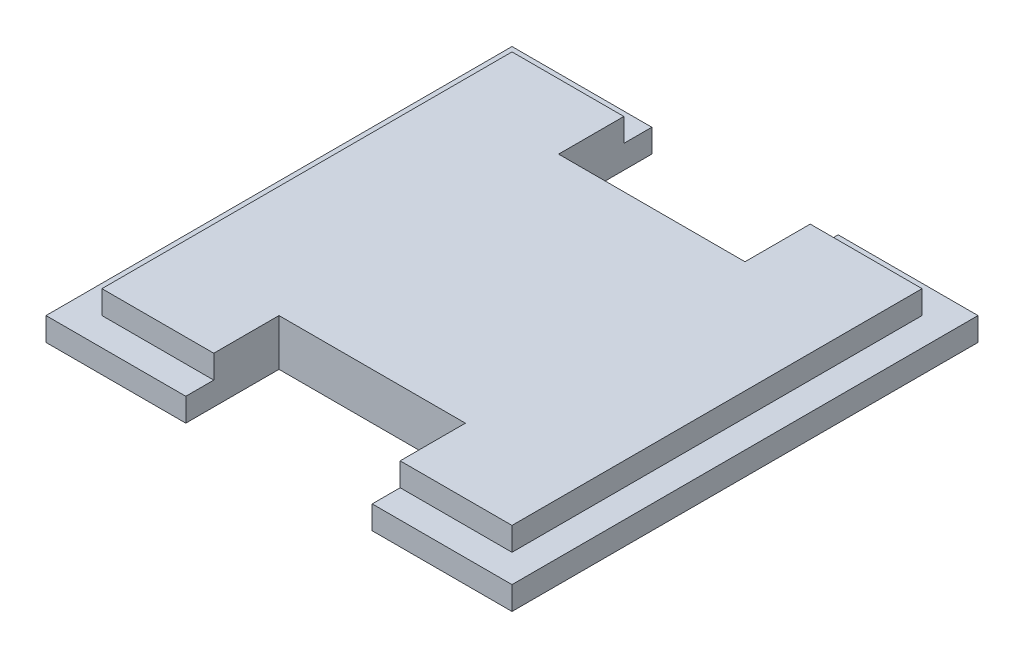
ISO-10303-21;
HEADER;
FILE_DESCRIPTION(('STEP AP214'),'2;1');
FILE_NAME('part.step','',(''),(''),'','','');
FILE_SCHEMA(('AUTOMOTIVE_DESIGN { 1 0 10303 214 1 1 1 1 }'));
ENDSEC;
DATA;
#1=APPLICATION_CONTEXT('core data for automotive mechanical design processes');
#2=APPLICATION_PROTOCOL_DEFINITION('international standard','automotive_design',2000,#1);
#3=PRODUCT_CONTEXT('',#1,'mechanical');
#4=PRODUCT('Part','Part','',(#3));
#5=PRODUCT_RELATED_PRODUCT_CATEGORY('part','',(#4));
#6=PRODUCT_DEFINITION_FORMATION('','',#4);
#7=PRODUCT_DEFINITION_CONTEXT('part definition',#1,'design');
#8=PRODUCT_DEFINITION('design','',#6,#7);
#9=PRODUCT_DEFINITION_SHAPE('','',#8);
#10=(LENGTH_UNIT() NAMED_UNIT(*) SI_UNIT(.MILLI.,.METRE.));
#11=(NAMED_UNIT(*) PLANE_ANGLE_UNIT() SI_UNIT($,.RADIAN.));
#12=(NAMED_UNIT(*) SI_UNIT($,.STERADIAN.) SOLID_ANGLE_UNIT());
#13=UNCERTAINTY_MEASURE_WITH_UNIT(LENGTH_MEASURE(1.E-05),#10,'distance_accuracy_value','');
#14=(GEOMETRIC_REPRESENTATION_CONTEXT(3) GLOBAL_UNCERTAINTY_ASSIGNED_CONTEXT((#13)) GLOBAL_UNIT_ASSIGNED_CONTEXT((#10,
#11,#12)) REPRESENTATION_CONTEXT('',''));
#15=CARTESIAN_POINT('',(0.,0.,0.));
#16=DIRECTION('',(0.,0.,1.));
#17=DIRECTION('',(1.,0.,0.));
#18=AXIS2_PLACEMENT_3D('',#15,#16,#17);
#19=CARTESIAN_POINT('',(0.,5.,0.));
#20=DIRECTION('',(0.,-1.,0.));
#21=DIRECTION('',(0.,0.,-1.));
#22=AXIS2_PLACEMENT_3D('',#19,#20,#21);
#23=PLANE('',#22);
#24=DIRECTION('',(-1.,0.,0.));
#25=VECTOR('',#24,1.);
#26=CARTESIAN_POINT('',(94.,5.,-94.));
#27=LINE('',#26,#25);
#28=CARTESIAN_POINT('',(30.,5.,-94.));
#29=VERTEX_POINT('',#28);
#30=CARTESIAN_POINT('',(6.,5.,-94.));
#31=VERTEX_POINT('',#30);
#32=EDGE_CURVE('E304',#29,#31,#27,.T.);
#33=ORIENTED_EDGE('',*,*,#32,.F.);
#34=DIRECTION('',(0.,0.,-1.));
#35=VECTOR('',#34,1.);
#36=CARTESIAN_POINT('',(30.,5.,0.));
#37=LINE('',#36,#35);
#38=CARTESIAN_POINT('',(30.,5.,-100.));
#39=VERTEX_POINT('',#38);
#40=EDGE_CURVE('E275',#29,#39,#37,.T.);
#41=ORIENTED_EDGE('',*,*,#40,.T.);
#42=DIRECTION('',(-1.,0.,0.));
#43=VECTOR('',#42,1.);
#44=CARTESIAN_POINT('',(0.,5.,-100.));
#45=LINE('',#44,#43);
#46=CARTESIAN_POINT('',(0.,5.,-100.));
#47=VERTEX_POINT('',#46);
#48=EDGE_CURVE('E342',#39,#47,#45,.T.);
#49=ORIENTED_EDGE('',*,*,#48,.T.);
#50=DIRECTION('',(0.,0.,1.));
#51=VECTOR('',#50,1.);
#52=CARTESIAN_POINT('',(0.,5.,0.));
#53=LINE('',#52,#51);
#54=CARTESIAN_POINT('',(0.,5.,0.));
#55=VERTEX_POINT('',#54);
#56=EDGE_CURVE('E329',#47,#55,#53,.T.);
#57=ORIENTED_EDGE('',*,*,#56,.T.);
#58=DIRECTION('',(1.,0.,0.));
#59=VECTOR('',#58,1.);
#60=CARTESIAN_POINT('',(0.,5.,0.));
#61=LINE('',#60,#59);
#62=CARTESIAN_POINT('',(30.,5.,0.));
#63=VERTEX_POINT('',#62);
#64=EDGE_CURVE('E335',#55,#63,#61,.T.);
#65=ORIENTED_EDGE('',*,*,#64,.T.);
#66=DIRECTION('',(0.,0.,-1.));
#67=VECTOR('',#66,1.);
#68=CARTESIAN_POINT('',(30.,5.,0.));
#69=LINE('',#68,#67);
#70=CARTESIAN_POINT('',(30.,5.,-6.));
#71=VERTEX_POINT('',#70);
#72=EDGE_CURVE('E261',#63,#71,#69,.T.);
#73=ORIENTED_EDGE('',*,*,#72,.T.);
#74=DIRECTION('',(1.,0.,0.));
#75=VECTOR('',#74,1.);
#76=CARTESIAN_POINT('',(6.,5.,-6.));
#77=LINE('',#76,#75);
#78=CARTESIAN_POINT('',(6.,5.,-6.));
#79=VERTEX_POINT('',#78);
#80=EDGE_CURVE('E296',#79,#71,#77,.T.);
#81=ORIENTED_EDGE('',*,*,#80,.F.);
#82=DIRECTION('',(0.,0.,1.));
#83=VECTOR('',#82,1.);
#84=CARTESIAN_POINT('',(6.,5.,-94.));
#85=LINE('',#84,#83);
#86=EDGE_CURVE('E309',#31,#79,#85,.T.);
#87=ORIENTED_EDGE('',*,*,#86,.F.);
#88=EDGE_LOOP('',(#33,#41,#49,#57,#65,#73,#81,#87));
#89=FACE_BOUND('',#88,.T.);
#90=ADVANCED_FACE('F41',(#89),#23,.F.);
#91=CARTESIAN_POINT('',(0.,5.,0.));
#92=DIRECTION('',(0.,0.,-1.));
#93=DIRECTION('',(-1.,0.,0.));
#94=AXIS2_PLACEMENT_3D('',#91,#92,#93);
#95=PLANE('',#94);
#96=DIRECTION('',(1.,0.,0.));
#97=VECTOR('',#96,1.);
#98=CARTESIAN_POINT('',(0.,0.,0.));
#99=LINE('',#98,#97);
#100=CARTESIAN_POINT('',(0.,0.,0.));
#101=VERTEX_POINT('',#100);
#102=CARTESIAN_POINT('',(30.,0.,0.));
#103=VERTEX_POINT('',#102);
#104=EDGE_CURVE('E352',#101,#103,#99,.T.);
#105=ORIENTED_EDGE('',*,*,#104,.T.);
#106=DIRECTION('',(0.,-1.,0.));
#107=VECTOR('',#106,1.);
#108=CARTESIAN_POINT('',(30.,10.,0.));
#109=LINE('',#108,#107);
#110=EDGE_CURVE('E211',#63,#103,#109,.T.);
#111=ORIENTED_EDGE('',*,*,#110,.F.);
#112=ORIENTED_EDGE('',*,*,#64,.F.);
#113=DIRECTION('',(0.,-1.,0.));
#114=VECTOR('',#113,1.);
#115=CARTESIAN_POINT('',(0.,5.,0.));
#116=LINE('',#115,#114);
#117=EDGE_CURVE('E374',#55,#101,#116,.T.);
#118=ORIENTED_EDGE('',*,*,#117,.T.);
#119=EDGE_LOOP('',(#105,#111,#112,#118));
#120=FACE_BOUND('',#119,.T.);
#121=ADVANCED_FACE('F396',(#120),#95,.F.);
#122=CARTESIAN_POINT('',(0.,5.,-100.));
#123=DIRECTION('',(0.,0.,1.));
#124=DIRECTION('',(1.,0.,0.));
#125=AXIS2_PLACEMENT_3D('',#122,#123,#124);
#126=PLANE('',#125);
#127=ORIENTED_EDGE('',*,*,#48,.F.);
#128=DIRECTION('',(0.,-1.,0.));
#129=VECTOR('',#128,1.);
#130=CARTESIAN_POINT('',(30.,10.,-100.));
#131=LINE('',#130,#129);
#132=CARTESIAN_POINT('',(30.,0.,-100.));
#133=VERTEX_POINT('',#132);
#134=EDGE_CURVE('E200',#39,#133,#131,.T.);
#135=ORIENTED_EDGE('',*,*,#134,.T.);
#136=DIRECTION('',(-1.,0.,0.));
#137=VECTOR('',#136,1.);
#138=CARTESIAN_POINT('',(0.,0.,-100.));
#139=LINE('',#138,#137);
#140=CARTESIAN_POINT('',(0.,0.,-100.));
#141=VERTEX_POINT('',#140);
#142=EDGE_CURVE('E359',#133,#141,#139,.T.);
#143=ORIENTED_EDGE('',*,*,#142,.T.);
#144=DIRECTION('',(0.,-1.,0.));
#145=VECTOR('',#144,1.);
#146=CARTESIAN_POINT('',(0.,5.,-100.));
#147=LINE('',#146,#145);
#148=EDGE_CURVE('E347',#47,#141,#147,.T.);
#149=ORIENTED_EDGE('',*,*,#148,.F.);
#150=EDGE_LOOP('',(#127,#135,#143,#149));
#151=FACE_BOUND('',#150,.T.);
#152=ADVANCED_FACE('F438',(#151),#126,.F.);
#153=CARTESIAN_POINT('',(6.,10.,-6.));
#154=DIRECTION('',(0.,0.,-1.));
#155=DIRECTION('',(-1.,0.,0.));
#156=AXIS2_PLACEMENT_3D('',#153,#154,#155);
#157=PLANE('',#156);
#158=ORIENTED_EDGE('',*,*,#80,.T.);
#159=DIRECTION('',(0.,1.,0.));
#160=VECTOR('',#159,1.);
#161=CARTESIAN_POINT('',(30.,10.,-6.));
#162=LINE('',#161,#160);
#163=CARTESIAN_POINT('',(30.,10.,-6.));
#164=VERTEX_POINT('',#163);
#165=EDGE_CURVE('E257',#71,#164,#162,.T.);
#166=ORIENTED_EDGE('',*,*,#165,.T.);
#167=DIRECTION('',(1.,0.,0.));
#168=VECTOR('',#167,1.);
#169=CARTESIAN_POINT('',(6.,10.,-6.));
#170=LINE('',#169,#168);
#171=CARTESIAN_POINT('',(6.,10.,-6.));
#172=VERTEX_POINT('',#171);
#173=EDGE_CURVE('E280',#172,#164,#170,.T.);
#174=ORIENTED_EDGE('',*,*,#173,.F.);
#175=DIRECTION('',(0.,-1.,0.));
#176=VECTOR('',#175,1.);
#177=CARTESIAN_POINT('',(6.,10.,-6.));
#178=LINE('',#177,#176);
#179=EDGE_CURVE('E295',#172,#79,#178,.T.);
#180=ORIENTED_EDGE('',*,*,#179,.T.);
#181=EDGE_LOOP('',(#158,#166,#174,#180));
#182=FACE_BOUND('',#181,.T.);
#183=ADVANCED_FACE('F384',(#182),#157,.F.);
#184=CARTESIAN_POINT('',(94.,10.,-94.));
#185=DIRECTION('',(0.,0.,1.));
#186=DIRECTION('',(1.,0.,0.));
#187=AXIS2_PLACEMENT_3D('',#184,#185,#186);
#188=PLANE('',#187);
#189=DIRECTION('',(-1.,0.,0.));
#190=VECTOR('',#189,1.);
#191=CARTESIAN_POINT('',(94.,10.,-94.));
#192=LINE('',#191,#190);
#193=CARTESIAN_POINT('',(30.,10.,-94.));
#194=VERTEX_POINT('',#193);
#195=CARTESIAN_POINT('',(6.,10.,-94.));
#196=VERTEX_POINT('',#195);
#197=EDGE_CURVE('E288',#194,#196,#192,.T.);
#198=ORIENTED_EDGE('',*,*,#197,.F.);
#199=DIRECTION('',(0.,-1.,0.));
#200=VECTOR('',#199,1.);
#201=CARTESIAN_POINT('',(30.,10.,-94.));
#202=LINE('',#201,#200);
#203=EDGE_CURVE('E191',#194,#29,#202,.T.);
#204=ORIENTED_EDGE('',*,*,#203,.T.);
#205=ORIENTED_EDGE('',*,*,#32,.T.);
#206=DIRECTION('',(0.,-1.,0.));
#207=VECTOR('',#206,1.);
#208=CARTESIAN_POINT('',(6.,10.,-94.));
#209=LINE('',#208,#207);
#210=EDGE_CURVE('E316',#196,#31,#209,.T.);
#211=ORIENTED_EDGE('',*,*,#210,.F.);
#212=EDGE_LOOP('',(#198,#204,#205,#211));
#213=FACE_BOUND('',#212,.T.);
#214=ADVANCED_FACE('F467',(#213),#188,.F.);
#215=CARTESIAN_POINT('',(100.,5.,-100.));
#216=VERTEX_POINT('',#215);
#217=CARTESIAN_POINT('',(70.,5.,-100.));
#218=VERTEX_POINT('',#217);
#219=EDGE_CURVE('E343',#216,#218,#45,.T.);
#220=ORIENTED_EDGE('',*,*,#219,.T.);
#221=DIRECTION('',(0.,0.,1.));
#222=VECTOR('',#221,1.);
#223=CARTESIAN_POINT('',(70.,5.,0.));
#224=LINE('',#223,#222);
#225=CARTESIAN_POINT('',(70.,5.,-94.));
#226=VERTEX_POINT('',#225);
#227=EDGE_CURVE('E269',#218,#226,#224,.T.);
#228=ORIENTED_EDGE('',*,*,#227,.T.);
#229=CARTESIAN_POINT('',(94.,5.,-94.));
#230=VERTEX_POINT('',#229);
#231=EDGE_CURVE('E305',#230,#226,#27,.T.);
#232=ORIENTED_EDGE('',*,*,#231,.F.);
#233=DIRECTION('',(0.,0.,-1.));
#234=VECTOR('',#233,1.);
#235=CARTESIAN_POINT('',(94.,5.,-6.));
#236=LINE('',#235,#234);
#237=CARTESIAN_POINT('',(94.,5.,-6.));
#238=VERTEX_POINT('',#237);
#239=EDGE_CURVE('E300',#238,#230,#236,.T.);
#240=ORIENTED_EDGE('',*,*,#239,.F.);
#241=CARTESIAN_POINT('',(70.,5.,-6.));
#242=VERTEX_POINT('',#241);
#243=EDGE_CURVE('E279',#242,#238,#77,.T.);
#244=ORIENTED_EDGE('',*,*,#243,.F.);
#245=DIRECTION('',(0.,0.,1.));
#246=VECTOR('',#245,1.);
#247=CARTESIAN_POINT('',(70.,5.,0.));
#248=LINE('',#247,#246);
#249=CARTESIAN_POINT('',(70.,5.,0.));
#250=VERTEX_POINT('',#249);
#251=EDGE_CURVE('E253',#242,#250,#248,.T.);
#252=ORIENTED_EDGE('',*,*,#251,.T.);
#253=CARTESIAN_POINT('',(100.,5.,0.));
#254=VERTEX_POINT('',#253);
#255=EDGE_CURVE('E333',#250,#254,#61,.T.);
#256=ORIENTED_EDGE('',*,*,#255,.T.);
#257=DIRECTION('',(0.,0.,-1.));
#258=VECTOR('',#257,1.);
#259=CARTESIAN_POINT('',(100.,5.,0.));
#260=LINE('',#259,#258);
#261=EDGE_CURVE('E339',#254,#216,#260,.T.);
#262=ORIENTED_EDGE('',*,*,#261,.T.);
#263=EDGE_LOOP('',(#220,#228,#232,#240,#244,#252,#256,#262));
#264=FACE_BOUND('',#263,.T.);
#265=ADVANCED_FACE('F418',(#264),#23,.F.);
#266=CARTESIAN_POINT('',(0.,5.,0.));
#267=DIRECTION('',(1.,0.,0.));
#268=DIRECTION('',(0.,0.,-1.));
#269=AXIS2_PLACEMENT_3D('',#266,#267,#268);
#270=PLANE('',#269);
#271=DIRECTION('',(0.,0.,1.));
#272=VECTOR('',#271,1.);
#273=CARTESIAN_POINT('',(0.,0.,0.));
#274=LINE('',#273,#272);
#275=EDGE_CURVE('E328',#141,#101,#274,.T.);
#276=ORIENTED_EDGE('',*,*,#275,.T.);
#277=ORIENTED_EDGE('',*,*,#117,.F.);
#278=ORIENTED_EDGE('',*,*,#56,.F.);
#279=ORIENTED_EDGE('',*,*,#148,.T.);
#280=EDGE_LOOP('',(#276,#277,#278,#279));
#281=FACE_BOUND('',#280,.T.);
#282=ADVANCED_FACE('F43',(#281),#270,.F.);
#283=ORIENTED_EDGE('',*,*,#255,.F.);
#284=DIRECTION('',(0.,-1.,0.));
#285=VECTOR('',#284,1.);
#286=CARTESIAN_POINT('',(70.,10.,0.));
#287=LINE('',#286,#285);
#288=CARTESIAN_POINT('',(70.,0.,0.));
#289=VERTEX_POINT('',#288);
#290=EDGE_CURVE('E241',#250,#289,#287,.T.);
#291=ORIENTED_EDGE('',*,*,#290,.T.);
#292=CARTESIAN_POINT('',(100.,0.,0.));
#293=VERTEX_POINT('',#292);
#294=EDGE_CURVE('E351',#289,#293,#99,.T.);
#295=ORIENTED_EDGE('',*,*,#294,.T.);
#296=DIRECTION('',(0.,-1.,0.));
#297=VECTOR('',#296,1.);
#298=CARTESIAN_POINT('',(100.,5.,0.));
#299=LINE('',#298,#297);
#300=EDGE_CURVE('E370',#254,#293,#299,.T.);
#301=ORIENTED_EDGE('',*,*,#300,.F.);
#302=EDGE_LOOP('',(#283,#291,#295,#301));
#303=FACE_BOUND('',#302,.T.);
#304=ADVANCED_FACE('F449',(#303),#95,.F.);
#305=CARTESIAN_POINT('',(100.,5.,0.));
#306=DIRECTION('',(-1.,0.,0.));
#307=DIRECTION('',(0.,0.,1.));
#308=AXIS2_PLACEMENT_3D('',#305,#306,#307);
#309=PLANE('',#308);
#310=DIRECTION('',(0.,0.,-1.));
#311=VECTOR('',#310,1.);
#312=CARTESIAN_POINT('',(100.,0.,0.));
#313=LINE('',#312,#311);
#314=CARTESIAN_POINT('',(100.,0.,-100.));
#315=VERTEX_POINT('',#314);
#316=EDGE_CURVE('E356',#293,#315,#313,.T.);
#317=ORIENTED_EDGE('',*,*,#316,.T.);
#318=DIRECTION('',(0.,-1.,0.));
#319=VECTOR('',#318,1.);
#320=CARTESIAN_POINT('',(100.,5.,-100.));
#321=LINE('',#320,#319);
#322=EDGE_CURVE('E366',#216,#315,#321,.T.);
#323=ORIENTED_EDGE('',*,*,#322,.F.);
#324=ORIENTED_EDGE('',*,*,#261,.F.);
#325=ORIENTED_EDGE('',*,*,#300,.T.);
#326=EDGE_LOOP('',(#317,#323,#324,#325));
#327=FACE_BOUND('',#326,.T.);
#328=ADVANCED_FACE('F451',(#327),#309,.F.);
#329=CARTESIAN_POINT('',(70.,0.,-100.));
#330=VERTEX_POINT('',#329);
#331=EDGE_CURVE('E334',#315,#330,#139,.T.);
#332=ORIENTED_EDGE('',*,*,#331,.T.);
#333=DIRECTION('',(0.,-1.,0.));
#334=VECTOR('',#333,1.);
#335=CARTESIAN_POINT('',(70.,10.,-100.));
#336=LINE('',#335,#334);
#337=EDGE_CURVE('E204',#218,#330,#336,.T.);
#338=ORIENTED_EDGE('',*,*,#337,.F.);
#339=ORIENTED_EDGE('',*,*,#219,.F.);
#340=ORIENTED_EDGE('',*,*,#322,.T.);
#341=EDGE_LOOP('',(#332,#338,#339,#340));
#342=FACE_BOUND('',#341,.T.);
#343=ADVANCED_FACE('F432',(#342),#126,.F.);
#344=CARTESIAN_POINT('',(0.,0.,0.));
#345=DIRECTION('',(0.,-1.,0.));
#346=DIRECTION('',(0.,0.,-1.));
#347=AXIS2_PLACEMENT_3D('',#344,#345,#346);
#348=PLANE('',#347);
#349=DIRECTION('',(0.,0.,-1.));
#350=VECTOR('',#349,1.);
#351=CARTESIAN_POINT('',(30.,0.,-100.));
#352=LINE('',#351,#350);
#353=CARTESIAN_POINT('',(30.,0.,-80.));
#354=VERTEX_POINT('',#353);
#355=EDGE_CURVE('E207',#354,#133,#352,.T.);
#356=ORIENTED_EDGE('',*,*,#355,.F.);
#357=DIRECTION('',(-1.,0.,0.));
#358=VECTOR('',#357,1.);
#359=CARTESIAN_POINT('',(30.,0.,-80.));
#360=LINE('',#359,#358);
#361=CARTESIAN_POINT('',(70.,0.,-80.));
#362=VERTEX_POINT('',#361);
#363=EDGE_CURVE('E180',#362,#354,#360,.T.);
#364=ORIENTED_EDGE('',*,*,#363,.F.);
#365=DIRECTION('',(0.,0.,1.));
#366=VECTOR('',#365,1.);
#367=CARTESIAN_POINT('',(70.,0.,-100.));
#368=LINE('',#367,#366);
#369=EDGE_CURVE('E210',#330,#362,#368,.T.);
#370=ORIENTED_EDGE('',*,*,#369,.F.);
#371=ORIENTED_EDGE('',*,*,#331,.F.);
#372=ORIENTED_EDGE('',*,*,#316,.F.);
#373=ORIENTED_EDGE('',*,*,#294,.F.);
#374=DIRECTION('',(0.,0.,1.));
#375=VECTOR('',#374,1.);
#376=CARTESIAN_POINT('',(70.,0.,0.));
#377=LINE('',#376,#375);
#378=CARTESIAN_POINT('',(70.,0.,-20.));
#379=VERTEX_POINT('',#378);
#380=EDGE_CURVE('E225',#379,#289,#377,.T.);
#381=ORIENTED_EDGE('',*,*,#380,.F.);
#382=DIRECTION('',(1.,0.,0.));
#383=VECTOR('',#382,1.);
#384=CARTESIAN_POINT('',(30.,0.,-20.));
#385=LINE('',#384,#383);
#386=CARTESIAN_POINT('',(30.,0.,-20.));
#387=VERTEX_POINT('',#386);
#388=EDGE_CURVE('E233',#387,#379,#385,.T.);
#389=ORIENTED_EDGE('',*,*,#388,.F.);
#390=DIRECTION('',(0.,0.,-1.));
#391=VECTOR('',#390,1.);
#392=CARTESIAN_POINT('',(30.,0.,0.));
#393=LINE('',#392,#391);
#394=EDGE_CURVE('E229',#103,#387,#393,.T.);
#395=ORIENTED_EDGE('',*,*,#394,.F.);
#396=ORIENTED_EDGE('',*,*,#104,.F.);
#397=ORIENTED_EDGE('',*,*,#275,.F.);
#398=ORIENTED_EDGE('',*,*,#142,.F.);
#399=EDGE_LOOP('',(#356,#364,#370,#371,#372,#373,#381,#389,#395,#396,#397,#398));
#400=FACE_BOUND('',#399,.T.);
#401=ADVANCED_FACE('F400',(#400),#348,.T.);
#402=CARTESIAN_POINT('',(70.,10.,-6.));
#403=VERTEX_POINT('',#402);
#404=CARTESIAN_POINT('',(94.,10.,-6.));
#405=VERTEX_POINT('',#404);
#406=EDGE_CURVE('E285',#403,#405,#170,.T.);
#407=ORIENTED_EDGE('',*,*,#406,.F.);
#408=DIRECTION('',(0.,-1.,0.));
#409=VECTOR('',#408,1.);
#410=CARTESIAN_POINT('',(70.,10.,-6.));
#411=LINE('',#410,#409);
#412=EDGE_CURVE('E184',#403,#242,#411,.T.);
#413=ORIENTED_EDGE('',*,*,#412,.T.);
#414=ORIENTED_EDGE('',*,*,#243,.T.);
#415=DIRECTION('',(0.,-1.,0.));
#416=VECTOR('',#415,1.);
#417=CARTESIAN_POINT('',(94.,10.,-6.));
#418=LINE('',#417,#416);
#419=EDGE_CURVE('E324',#405,#238,#418,.T.);
#420=ORIENTED_EDGE('',*,*,#419,.F.);
#421=EDGE_LOOP('',(#407,#413,#414,#420));
#422=FACE_BOUND('',#421,.T.);
#423=ADVANCED_FACE('F411',(#422),#157,.F.);
#424=CARTESIAN_POINT('',(94.,10.,-6.));
#425=DIRECTION('',(-1.,0.,0.));
#426=DIRECTION('',(0.,0.,1.));
#427=AXIS2_PLACEMENT_3D('',#424,#425,#426);
#428=PLANE('',#427);
#429=ORIENTED_EDGE('',*,*,#239,.T.);
#430=DIRECTION('',(0.,-1.,0.));
#431=VECTOR('',#430,1.);
#432=CARTESIAN_POINT('',(94.,10.,-94.));
#433=LINE('',#432,#431);
#434=CARTESIAN_POINT('',(94.,10.,-94.));
#435=VERTEX_POINT('',#434);
#436=EDGE_CURVE('E320',#435,#230,#433,.T.);
#437=ORIENTED_EDGE('',*,*,#436,.F.);
#438=DIRECTION('',(0.,0.,-1.));
#439=VECTOR('',#438,1.);
#440=CARTESIAN_POINT('',(94.,10.,-6.));
#441=LINE('',#440,#439);
#442=EDGE_CURVE('E284',#405,#435,#441,.T.);
#443=ORIENTED_EDGE('',*,*,#442,.F.);
#444=ORIENTED_EDGE('',*,*,#419,.T.);
#445=EDGE_LOOP('',(#429,#437,#443,#444));
#446=FACE_BOUND('',#445,.T.);
#447=ADVANCED_FACE('F421',(#446),#428,.F.);
#448=ORIENTED_EDGE('',*,*,#231,.T.);
#449=DIRECTION('',(0.,1.,0.));
#450=VECTOR('',#449,1.);
#451=CARTESIAN_POINT('',(70.,10.,-94.));
#452=LINE('',#451,#450);
#453=CARTESIAN_POINT('',(70.,10.,-94.));
#454=VERTEX_POINT('',#453);
#455=EDGE_CURVE('E265',#226,#454,#452,.T.);
#456=ORIENTED_EDGE('',*,*,#455,.T.);
#457=EDGE_CURVE('E289',#435,#454,#192,.T.);
#458=ORIENTED_EDGE('',*,*,#457,.F.);
#459=ORIENTED_EDGE('',*,*,#436,.T.);
#460=EDGE_LOOP('',(#448,#456,#458,#459));
#461=FACE_BOUND('',#460,.T.);
#462=ADVANCED_FACE('F424',(#461),#188,.F.);
#463=CARTESIAN_POINT('',(6.,10.,-94.));
#464=DIRECTION('',(1.,0.,0.));
#465=DIRECTION('',(0.,0.,-1.));
#466=AXIS2_PLACEMENT_3D('',#463,#464,#465);
#467=PLANE('',#466);
#468=ORIENTED_EDGE('',*,*,#86,.T.);
#469=ORIENTED_EDGE('',*,*,#179,.F.);
#470=DIRECTION('',(0.,0.,1.));
#471=VECTOR('',#470,1.);
#472=CARTESIAN_POINT('',(6.,10.,-94.));
#473=LINE('',#472,#471);
#474=EDGE_CURVE('E292',#196,#172,#473,.T.);
#475=ORIENTED_EDGE('',*,*,#474,.F.);
#476=ORIENTED_EDGE('',*,*,#210,.T.);
#477=EDGE_LOOP('',(#468,#469,#475,#476));
#478=FACE_BOUND('',#477,.T.);
#479=ADVANCED_FACE('F389',(#478),#467,.F.);
#480=CARTESIAN_POINT('',(0.,10.,0.));
#481=DIRECTION('',(0.,1.,0.));
#482=DIRECTION('',(0.,0.,1.));
#483=AXIS2_PLACEMENT_3D('',#480,#481,#482);
#484=PLANE('',#483);
#485=DIRECTION('',(0.,0.,-1.));
#486=VECTOR('',#485,1.);
#487=CARTESIAN_POINT('',(30.,10.,-100.));
#488=LINE('',#487,#486);
#489=CARTESIAN_POINT('',(30.,10.,-80.));
#490=VERTEX_POINT('',#489);
#491=EDGE_CURVE('E188',#490,#194,#488,.T.);
#492=ORIENTED_EDGE('',*,*,#491,.T.);
#493=ORIENTED_EDGE('',*,*,#197,.T.);
#494=ORIENTED_EDGE('',*,*,#474,.T.);
#495=ORIENTED_EDGE('',*,*,#173,.T.);
#496=DIRECTION('',(0.,0.,1.));
#497=VECTOR('',#496,1.);
#498=CARTESIAN_POINT('',(30.,10.,0.));
#499=LINE('',#498,#497);
#500=CARTESIAN_POINT('',(30.,10.,-20.));
#501=VERTEX_POINT('',#500);
#502=EDGE_CURVE('E50',#501,#164,#499,.T.);
#503=ORIENTED_EDGE('',*,*,#502,.F.);
#504=DIRECTION('',(1.,0.,0.));
#505=VECTOR('',#504,1.);
#506=CARTESIAN_POINT('',(30.,10.,-20.));
#507=LINE('',#506,#505);
#508=CARTESIAN_POINT('',(70.,10.,-20.));
#509=VERTEX_POINT('',#508);
#510=EDGE_CURVE('E221',#501,#509,#507,.T.);
#511=ORIENTED_EDGE('',*,*,#510,.T.);
#512=DIRECTION('',(0.,0.,1.));
#513=VECTOR('',#512,1.);
#514=CARTESIAN_POINT('',(70.,10.,0.));
#515=LINE('',#514,#513);
#516=EDGE_CURVE('E65',#509,#403,#515,.T.);
#517=ORIENTED_EDGE('',*,*,#516,.T.);
#518=ORIENTED_EDGE('',*,*,#406,.T.);
#519=ORIENTED_EDGE('',*,*,#442,.T.);
#520=ORIENTED_EDGE('',*,*,#457,.T.);
#521=DIRECTION('',(0.,0.,-1.));
#522=VECTOR('',#521,1.);
#523=CARTESIAN_POINT('',(70.,10.,0.));
#524=LINE('',#523,#522);
#525=CARTESIAN_POINT('',(70.,10.,-80.));
#526=VERTEX_POINT('',#525);
#527=EDGE_CURVE('E11',#526,#454,#524,.T.);
#528=ORIENTED_EDGE('',*,*,#527,.F.);
#529=DIRECTION('',(-1.,0.,0.));
#530=VECTOR('',#529,1.);
#531=CARTESIAN_POINT('',(30.,10.,-80.));
#532=LINE('',#531,#530);
#533=EDGE_CURVE('E57',#526,#490,#532,.T.);
#534=ORIENTED_EDGE('',*,*,#533,.T.);
#535=EDGE_LOOP('',(#492,#493,#494,#495,#503,#511,#517,#518,#519,#520,#528,#534));
#536=FACE_BOUND('',#535,.T.);
#537=ADVANCED_FACE('F197',(#536),#484,.T.);
#538=CARTESIAN_POINT('',(30.,10.,0.));
#539=DIRECTION('',(-1.,0.,0.));
#540=DIRECTION('',(0.,0.,1.));
#541=AXIS2_PLACEMENT_3D('',#538,#539,#540);
#542=PLANE('',#541);
#543=ORIENTED_EDGE('',*,*,#110,.T.);
#544=ORIENTED_EDGE('',*,*,#394,.T.);
#545=DIRECTION('',(0.,-1.,0.));
#546=VECTOR('',#545,1.);
#547=CARTESIAN_POINT('',(30.,10.,-20.));
#548=LINE('',#547,#546);
#549=EDGE_CURVE('E228',#501,#387,#548,.T.);
#550=ORIENTED_EDGE('',*,*,#549,.F.);
#551=ORIENTED_EDGE('',*,*,#502,.T.);
#552=ORIENTED_EDGE('',*,*,#165,.F.);
#553=ORIENTED_EDGE('',*,*,#72,.F.);
#554=EDGE_LOOP('',(#543,#544,#550,#551,#552,#553));
#555=FACE_BOUND('',#554,.T.);
#556=ADVANCED_FACE('F380',(#555),#542,.F.);
#557=CARTESIAN_POINT('',(70.,10.,0.));
#558=DIRECTION('',(1.,0.,0.));
#559=DIRECTION('',(0.,0.,-1.));
#560=AXIS2_PLACEMENT_3D('',#557,#558,#559);
#561=PLANE('',#560);
#562=ORIENTED_EDGE('',*,*,#412,.F.);
#563=ORIENTED_EDGE('',*,*,#516,.F.);
#564=DIRECTION('',(0.,-1.,0.));
#565=VECTOR('',#564,1.);
#566=CARTESIAN_POINT('',(70.,10.,-20.));
#567=LINE('',#566,#565);
#568=EDGE_CURVE('E245',#509,#379,#567,.T.);
#569=ORIENTED_EDGE('',*,*,#568,.T.);
#570=ORIENTED_EDGE('',*,*,#380,.T.);
#571=ORIENTED_EDGE('',*,*,#290,.F.);
#572=ORIENTED_EDGE('',*,*,#251,.F.);
#573=EDGE_LOOP('',(#562,#563,#569,#570,#571,#572));
#574=FACE_BOUND('',#573,.T.);
#575=ADVANCED_FACE('F579',(#574),#561,.F.);
#576=CARTESIAN_POINT('',(30.,10.,-20.));
#577=DIRECTION('',(0.,0.,-1.));
#578=DIRECTION('',(-1.,0.,0.));
#579=AXIS2_PLACEMENT_3D('',#576,#577,#578);
#580=PLANE('',#579);
#581=ORIENTED_EDGE('',*,*,#388,.T.);
#582=ORIENTED_EDGE('',*,*,#568,.F.);
#583=ORIENTED_EDGE('',*,*,#510,.F.);
#584=ORIENTED_EDGE('',*,*,#549,.T.);
#585=EDGE_LOOP('',(#581,#582,#583,#584));
#586=FACE_BOUND('',#585,.T.);
#587=ADVANCED_FACE('F406',(#586),#580,.F.);
#588=CARTESIAN_POINT('',(30.,10.,-100.));
#589=DIRECTION('',(-1.,0.,0.));
#590=DIRECTION('',(0.,0.,1.));
#591=AXIS2_PLACEMENT_3D('',#588,#589,#590);
#592=PLANE('',#591);
#593=ORIENTED_EDGE('',*,*,#203,.F.);
#594=ORIENTED_EDGE('',*,*,#491,.F.);
#595=DIRECTION('',(0.,-1.,0.));
#596=VECTOR('',#595,1.);
#597=CARTESIAN_POINT('',(30.,10.,-80.));
#598=LINE('',#597,#596);
#599=EDGE_CURVE('E176',#490,#354,#598,.T.);
#600=ORIENTED_EDGE('',*,*,#599,.T.);
#601=ORIENTED_EDGE('',*,*,#355,.T.);
#602=ORIENTED_EDGE('',*,*,#134,.F.);
#603=ORIENTED_EDGE('',*,*,#40,.F.);
#604=EDGE_LOOP('',(#593,#594,#600,#601,#602,#603));
#605=FACE_BOUND('',#604,.T.);
#606=ADVANCED_FACE('F189',(#605),#592,.F.);
#607=CARTESIAN_POINT('',(70.,10.,-100.));
#608=DIRECTION('',(1.,0.,0.));
#609=DIRECTION('',(0.,0.,-1.));
#610=AXIS2_PLACEMENT_3D('',#607,#608,#609);
#611=PLANE('',#610);
#612=ORIENTED_EDGE('',*,*,#337,.T.);
#613=ORIENTED_EDGE('',*,*,#369,.T.);
#614=DIRECTION('',(0.,-1.,0.));
#615=VECTOR('',#614,1.);
#616=CARTESIAN_POINT('',(70.,10.,-80.));
#617=LINE('',#616,#615);
#618=EDGE_CURVE('E185',#526,#362,#617,.T.);
#619=ORIENTED_EDGE('',*,*,#618,.F.);
#620=ORIENTED_EDGE('',*,*,#527,.T.);
#621=ORIENTED_EDGE('',*,*,#455,.F.);
#622=ORIENTED_EDGE('',*,*,#227,.F.);
#623=EDGE_LOOP('',(#612,#613,#619,#620,#621,#622));
#624=FACE_BOUND('',#623,.T.);
#625=ADVANCED_FACE('F426',(#624),#611,.F.);
#626=CARTESIAN_POINT('',(30.,10.,-80.));
#627=DIRECTION('',(0.,0.,1.));
#628=DIRECTION('',(1.,0.,0.));
#629=AXIS2_PLACEMENT_3D('',#626,#627,#628);
#630=PLANE('',#629);
#631=ORIENTED_EDGE('',*,*,#363,.T.);
#632=ORIENTED_EDGE('',*,*,#599,.F.);
#633=ORIENTED_EDGE('',*,*,#533,.F.);
#634=ORIENTED_EDGE('',*,*,#618,.T.);
#635=EDGE_LOOP('',(#631,#632,#633,#634));
#636=FACE_BOUND('',#635,.T.);
#637=ADVANCED_FACE('F178',(#636),#630,.F.);
#638=CLOSED_SHELL('',(#90,#121,#152,#183,#214,#265,#282,#304,#328,#343,#401,#423,#447,#462,#479,
#537,#556,#575,#587,#606,#625,#637));
#639=MANIFOLD_SOLID_BREP('B2',#638);
#640=ADVANCED_BREP_SHAPE_REPRESENTATION('',(#18,#639),#14);
#641=SHAPE_DEFINITION_REPRESENTATION(#9,#640);
ENDSEC;
END-ISO-10303-21;
